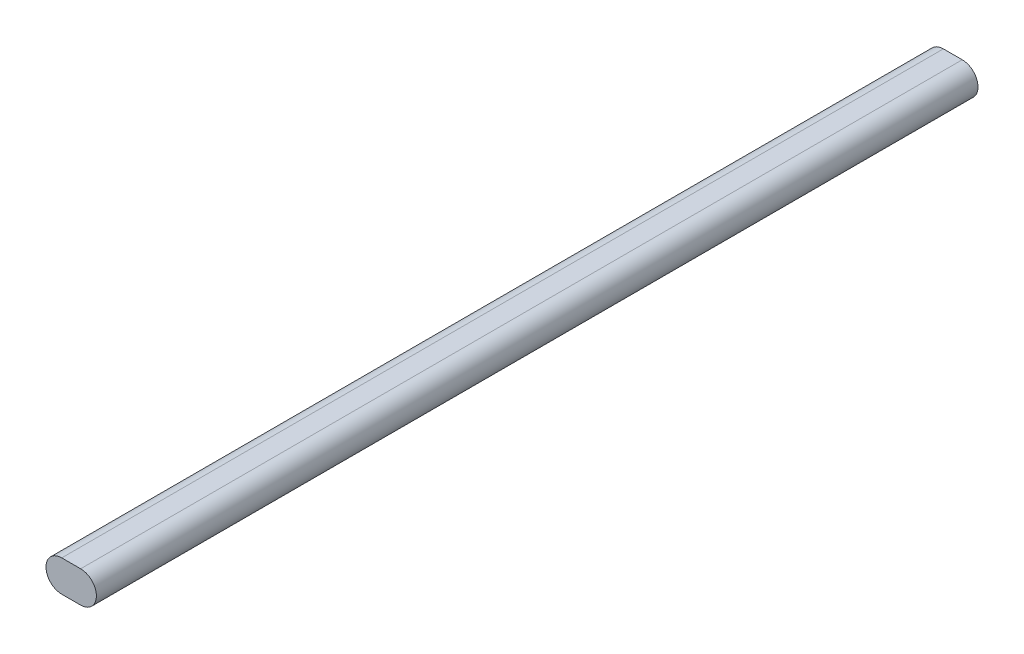
ISO-10303-21;
HEADER;
FILE_DESCRIPTION(('STEP AP214'),'2;1');
FILE_NAME('part.step','',(''),(''),'','','');
FILE_SCHEMA(('AUTOMOTIVE_DESIGN { 1 0 10303 214 1 1 1 1 }'));
ENDSEC;
DATA;
#1=APPLICATION_CONTEXT('core data for automotive mechanical design processes');
#2=APPLICATION_PROTOCOL_DEFINITION('international standard','automotive_design',2000,#1);
#3=PRODUCT_CONTEXT('',#1,'mechanical');
#4=PRODUCT('Part','Part','',(#3));
#5=PRODUCT_RELATED_PRODUCT_CATEGORY('part','',(#4));
#6=PRODUCT_DEFINITION_FORMATION('','',#4);
#7=PRODUCT_DEFINITION_CONTEXT('part definition',#1,'design');
#8=PRODUCT_DEFINITION('design','',#6,#7);
#9=PRODUCT_DEFINITION_SHAPE('','',#8);
#10=(LENGTH_UNIT() NAMED_UNIT(*) SI_UNIT(.MILLI.,.METRE.));
#11=(NAMED_UNIT(*) PLANE_ANGLE_UNIT() SI_UNIT($,.RADIAN.));
#12=(NAMED_UNIT(*) SI_UNIT($,.STERADIAN.) SOLID_ANGLE_UNIT());
#13=UNCERTAINTY_MEASURE_WITH_UNIT(LENGTH_MEASURE(1.E-05),#10,'distance_accuracy_value','');
#14=(GEOMETRIC_REPRESENTATION_CONTEXT(3) GLOBAL_UNCERTAINTY_ASSIGNED_CONTEXT((#13)) GLOBAL_UNIT_ASSIGNED_CONTEXT((#10,
#11,#12)) REPRESENTATION_CONTEXT('',''));
#15=CARTESIAN_POINT('',(0.,0.,0.));
#16=DIRECTION('',(0.,0.,1.));
#17=DIRECTION('',(1.,0.,0.));
#18=AXIS2_PLACEMENT_3D('',#15,#16,#17);
#19=CARTESIAN_POINT('',(0.,-12.5,700.));
#20=DIRECTION('',(0.,-1.,0.));
#21=DIRECTION('',(1.,0.,0.));
#22=AXIS2_PLACEMENT_3D('',#19,#20,#21);
#23=PLANE('',#22);
#24=DIRECTION('',(-1.,0.,0.));
#25=VECTOR('',#24,1.);
#26=CARTESIAN_POINT('',(0.,-12.5,0.));
#27=LINE('',#26,#25);
#28=CARTESIAN_POINT('',(7.50000000000001,-12.5,0.));
#29=VERTEX_POINT('',#28);
#30=CARTESIAN_POINT('',(-7.49999999999999,-12.5,0.));
#31=VERTEX_POINT('',#30);
#32=EDGE_CURVE('E108',#29,#31,#27,.T.);
#33=ORIENTED_EDGE('',*,*,#32,.F.);
#34=DIRECTION('',(0.,0.,-1.));
#35=VECTOR('',#34,1.);
#36=CARTESIAN_POINT('',(7.50000000000001,-12.5,700.));
#37=LINE('',#36,#35);
#38=CARTESIAN_POINT('',(7.50000000000001,-12.5,700.));
#39=VERTEX_POINT('',#38);
#40=EDGE_CURVE('E11',#39,#29,#37,.T.);
#41=ORIENTED_EDGE('',*,*,#40,.F.);
#42=DIRECTION('',(-1.,0.,0.));
#43=VECTOR('',#42,1.);
#44=CARTESIAN_POINT('',(0.,-12.5,700.));
#45=LINE('',#44,#43);
#46=CARTESIAN_POINT('',(-7.49999999999999,-12.5,700.));
#47=VERTEX_POINT('',#46);
#48=EDGE_CURVE('E92',#39,#47,#45,.T.);
#49=ORIENTED_EDGE('',*,*,#48,.T.);
#50=DIRECTION('',(0.,0.,-1.));
#51=VECTOR('',#50,1.);
#52=CARTESIAN_POINT('',(-7.49999999999999,-12.5,700.));
#53=LINE('',#52,#51);
#54=EDGE_CURVE('E81',#47,#31,#53,.T.);
#55=ORIENTED_EDGE('',*,*,#54,.T.);
#56=EDGE_LOOP('',(#33,#41,#49,#55));
#57=FACE_BOUND('',#56,.T.);
#58=ADVANCED_FACE('F41',(#57),#23,.T.);
#59=CARTESIAN_POINT('',(7.50000000000001,0.,700.));
#60=DIRECTION('',(0.,0.,-1.));
#61=DIRECTION('',(-1.,0.,0.));
#62=AXIS2_PLACEMENT_3D('',#59,#60,#61);
#63=CYLINDRICAL_SURFACE('',#62,12.5);
#64=CARTESIAN_POINT('',(7.50000000000001,0.,0.));
#65=DIRECTION('',(0.,0.,1.));
#66=DIRECTION('',(1.,0.,0.));
#67=AXIS2_PLACEMENT_3D('',#64,#65,#66);
#68=CIRCLE('',#67,12.5);
#69=CARTESIAN_POINT('',(7.50000000000001,12.5,0.));
#70=VERTEX_POINT('',#69);
#71=EDGE_CURVE('E98',#29,#70,#68,.T.);
#72=ORIENTED_EDGE('',*,*,#71,.T.);
#73=DIRECTION('',(0.,0.,-1.));
#74=VECTOR('',#73,1.);
#75=CARTESIAN_POINT('',(7.50000000000001,12.5,700.));
#76=LINE('',#75,#74);
#77=CARTESIAN_POINT('',(7.50000000000001,12.5,700.));
#78=VERTEX_POINT('',#77);
#79=EDGE_CURVE('E50',#78,#70,#76,.T.);
#80=ORIENTED_EDGE('',*,*,#79,.F.);
#81=CARTESIAN_POINT('',(7.50000000000001,0.,700.));
#82=DIRECTION('',(0.,0.,1.));
#83=DIRECTION('',(1.,0.,0.));
#84=AXIS2_PLACEMENT_3D('',#81,#82,#83);
#85=CIRCLE('',#84,12.5);
#86=EDGE_CURVE('E87',#39,#78,#85,.T.);
#87=ORIENTED_EDGE('',*,*,#86,.F.);
#88=ORIENTED_EDGE('',*,*,#40,.T.);
#89=EDGE_LOOP('',(#72,#80,#87,#88));
#90=FACE_BOUND('',#89,.T.);
#91=ADVANCED_FACE('F96',(#90),#63,.T.);
#92=CARTESIAN_POINT('',(0.,12.5,700.));
#93=DIRECTION('',(0.,-1.,0.));
#94=DIRECTION('',(1.,0.,0.));
#95=AXIS2_PLACEMENT_3D('',#92,#93,#94);
#96=PLANE('',#95);
#97=DIRECTION('',(-1.,0.,0.));
#98=VECTOR('',#97,1.);
#99=CARTESIAN_POINT('',(0.,12.5,0.));
#100=LINE('',#99,#98);
#101=CARTESIAN_POINT('',(-7.5,12.5,0.));
#102=VERTEX_POINT('',#101);
#103=EDGE_CURVE('E74',#70,#102,#100,.T.);
#104=ORIENTED_EDGE('',*,*,#103,.T.);
#105=DIRECTION('',(0.,0.,-1.));
#106=VECTOR('',#105,1.);
#107=CARTESIAN_POINT('',(-7.5,12.5,700.));
#108=LINE('',#107,#106);
#109=CARTESIAN_POINT('',(-7.5,12.5,700.));
#110=VERTEX_POINT('',#109);
#111=EDGE_CURVE('E100',#110,#102,#108,.T.);
#112=ORIENTED_EDGE('',*,*,#111,.F.);
#113=DIRECTION('',(-1.,0.,0.));
#114=VECTOR('',#113,1.);
#115=CARTESIAN_POINT('',(0.,12.5,700.));
#116=LINE('',#115,#114);
#117=EDGE_CURVE('E91',#78,#110,#116,.T.);
#118=ORIENTED_EDGE('',*,*,#117,.F.);
#119=ORIENTED_EDGE('',*,*,#79,.T.);
#120=EDGE_LOOP('',(#104,#112,#118,#119));
#121=FACE_BOUND('',#120,.T.);
#122=ADVANCED_FACE('F101',(#121),#96,.F.);
#123=CARTESIAN_POINT('',(-7.5,0.,700.));
#124=DIRECTION('',(0.,0.,-1.));
#125=DIRECTION('',(-1.,0.,0.));
#126=AXIS2_PLACEMENT_3D('',#123,#124,#125);
#127=CYLINDRICAL_SURFACE('',#126,12.5);
#128=CARTESIAN_POINT('',(-7.5,0.,0.));
#129=DIRECTION('',(0.,0.,1.));
#130=DIRECTION('',(1.,0.,0.));
#131=AXIS2_PLACEMENT_3D('',#128,#129,#130);
#132=CIRCLE('',#131,12.5);
#133=EDGE_CURVE('E116',#102,#31,#132,.T.);
#134=ORIENTED_EDGE('',*,*,#133,.T.);
#135=ORIENTED_EDGE('',*,*,#54,.F.);
#136=CARTESIAN_POINT('',(-7.5,0.,700.));
#137=DIRECTION('',(0.,0.,1.));
#138=DIRECTION('',(1.,0.,0.));
#139=AXIS2_PLACEMENT_3D('',#136,#137,#138);
#140=CIRCLE('',#139,12.5);
#141=EDGE_CURVE('E58',#110,#47,#140,.T.);
#142=ORIENTED_EDGE('',*,*,#141,.F.);
#143=ORIENTED_EDGE('',*,*,#111,.T.);
#144=EDGE_LOOP('',(#134,#135,#142,#143));
#145=FACE_BOUND('',#144,.T.);
#146=ADVANCED_FACE('F124',(#145),#127,.T.);
#147=CARTESIAN_POINT('',(0.,0.,700.));
#148=DIRECTION('',(0.,0.,1.));
#149=DIRECTION('',(1.,0.,0.));
#150=AXIS2_PLACEMENT_3D('',#147,#148,#149);
#151=PLANE('',#150);
#152=ORIENTED_EDGE('',*,*,#48,.F.);
#153=ORIENTED_EDGE('',*,*,#86,.T.);
#154=ORIENTED_EDGE('',*,*,#117,.T.);
#155=ORIENTED_EDGE('',*,*,#141,.T.);
#156=EDGE_LOOP('',(#152,#153,#154,#155));
#157=FACE_BOUND('',#156,.T.);
#158=ADVANCED_FACE('F89',(#157),#151,.T.);
#159=CARTESIAN_POINT('',(0.,0.,0.));
#160=DIRECTION('',(0.,0.,1.));
#161=DIRECTION('',(1.,0.,0.));
#162=AXIS2_PLACEMENT_3D('',#159,#160,#161);
#163=PLANE('',#162);
#164=ORIENTED_EDGE('',*,*,#32,.T.);
#165=ORIENTED_EDGE('',*,*,#133,.F.);
#166=ORIENTED_EDGE('',*,*,#103,.F.);
#167=ORIENTED_EDGE('',*,*,#71,.F.);
#168=EDGE_LOOP('',(#164,#165,#166,#167));
#169=FACE_BOUND('',#168,.T.);
#170=ADVANCED_FACE('F126',(#169),#163,.F.);
#171=CLOSED_SHELL('',(#58,#91,#122,#146,#158,#170));
#172=MANIFOLD_SOLID_BREP('B2',#171);
#173=ADVANCED_BREP_SHAPE_REPRESENTATION('',(#18,#172),#14);
#174=SHAPE_DEFINITION_REPRESENTATION(#9,#173);
ENDSEC;
END-ISO-10303-21;
